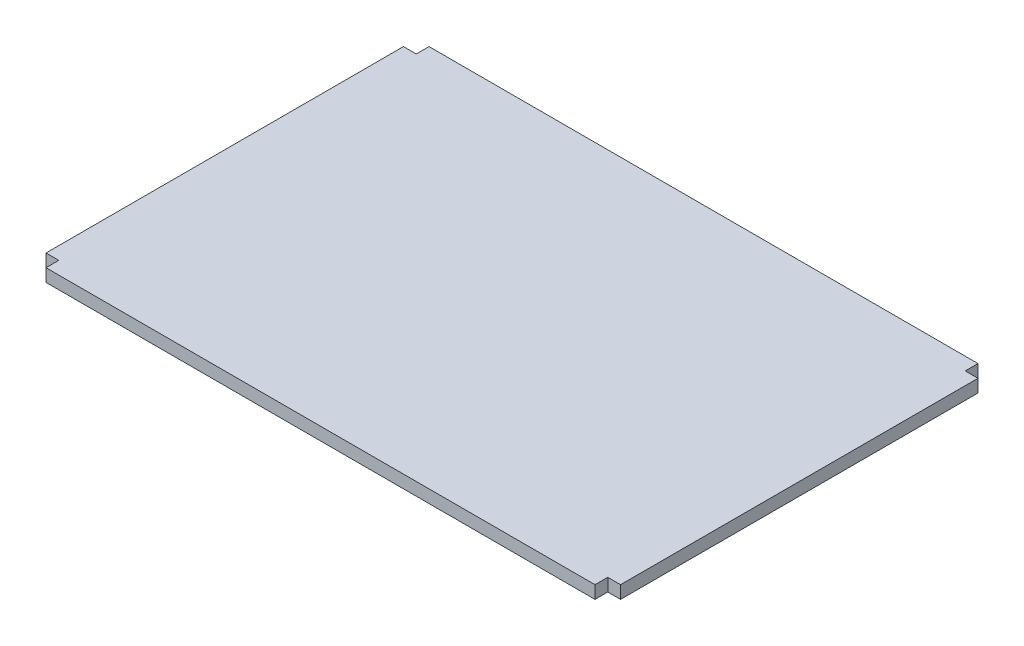
ISO-10303-21;
HEADER;
FILE_DESCRIPTION(('STEP AP214'),'2;1');
FILE_NAME('part.step','',(''),(''),'','','');
FILE_SCHEMA(('AUTOMOTIVE_DESIGN { 1 0 10303 214 1 1 1 1 }'));
ENDSEC;
DATA;
#1=APPLICATION_CONTEXT('core data for automotive mechanical design processes');
#2=APPLICATION_PROTOCOL_DEFINITION('international standard','automotive_design',2000,#1);
#3=PRODUCT_CONTEXT('',#1,'mechanical');
#4=PRODUCT('Part','Part','',(#3));
#5=PRODUCT_RELATED_PRODUCT_CATEGORY('part','',(#4));
#6=PRODUCT_DEFINITION_FORMATION('','',#4);
#7=PRODUCT_DEFINITION_CONTEXT('part definition',#1,'design');
#8=PRODUCT_DEFINITION('design','',#6,#7);
#9=PRODUCT_DEFINITION_SHAPE('','',#8);
#10=(LENGTH_UNIT() NAMED_UNIT(*) SI_UNIT(.MILLI.,.METRE.));
#11=(NAMED_UNIT(*) PLANE_ANGLE_UNIT() SI_UNIT($,.RADIAN.));
#12=(NAMED_UNIT(*) SI_UNIT($,.STERADIAN.) SOLID_ANGLE_UNIT());
#13=UNCERTAINTY_MEASURE_WITH_UNIT(LENGTH_MEASURE(1.E-05),#10,'distance_accuracy_value','');
#14=(GEOMETRIC_REPRESENTATION_CONTEXT(3) GLOBAL_UNCERTAINTY_ASSIGNED_CONTEXT((#13)) GLOBAL_UNIT_ASSIGNED_CONTEXT((#10,
#11,#12)) REPRESENTATION_CONTEXT('',''));
#15=CARTESIAN_POINT('',(0.,0.,0.));
#16=DIRECTION('',(0.,0.,1.));
#17=DIRECTION('',(1.,0.,0.));
#18=AXIS2_PLACEMENT_3D('',#15,#16,#17);
#19=CARTESIAN_POINT('',(-450.,20.,-300.));
#20=DIRECTION('',(1.,0.,0.));
#21=DIRECTION('',(0.,0.,-1.));
#22=AXIS2_PLACEMENT_3D('',#19,#20,#21);
#23=PLANE('',#22);
#24=DIRECTION('',(0.,0.,1.));
#25=VECTOR('',#24,1.);
#26=CARTESIAN_POINT('',(-450.,0.,-300.));
#27=LINE('',#26,#25);
#28=CARTESIAN_POINT('',(-450.,0.,-280.));
#29=VERTEX_POINT('',#28);
#30=CARTESIAN_POINT('',(-450.,0.,280.));
#31=VERTEX_POINT('',#30);
#32=EDGE_CURVE('E147',#29,#31,#27,.T.);
#33=ORIENTED_EDGE('',*,*,#32,.T.);
#34=DIRECTION('',(0.,1.,0.));
#35=VECTOR('',#34,1.);
#36=CARTESIAN_POINT('',(-450.,0.,280.));
#37=LINE('',#36,#35);
#38=CARTESIAN_POINT('',(-450.,20.,280.));
#39=VERTEX_POINT('',#38);
#40=EDGE_CURVE('E204',#31,#39,#37,.T.);
#41=ORIENTED_EDGE('',*,*,#40,.T.);
#42=DIRECTION('',(0.,0.,1.));
#43=VECTOR('',#42,1.);
#44=CARTESIAN_POINT('',(-450.,20.,-300.));
#45=LINE('',#44,#43);
#46=CARTESIAN_POINT('',(-450.,20.,-280.));
#47=VERTEX_POINT('',#46);
#48=EDGE_CURVE('E155',#47,#39,#45,.T.);
#49=ORIENTED_EDGE('',*,*,#48,.F.);
#50=DIRECTION('',(0.,1.,0.));
#51=VECTOR('',#50,1.);
#52=CARTESIAN_POINT('',(-450.,0.,-280.));
#53=LINE('',#52,#51);
#54=EDGE_CURVE('E192',#29,#47,#53,.T.);
#55=ORIENTED_EDGE('',*,*,#54,.F.);
#56=EDGE_LOOP('',(#33,#41,#49,#55));
#57=FACE_BOUND('',#56,.T.);
#58=ADVANCED_FACE('F34',(#57),#23,.F.);
#59=CARTESIAN_POINT('',(450.,20.,300.));
#60=DIRECTION('',(0.,0.,-1.));
#61=DIRECTION('',(-1.,0.,0.));
#62=AXIS2_PLACEMENT_3D('',#59,#60,#61);
#63=PLANE('',#62);
#64=DIRECTION('',(1.,0.,0.));
#65=VECTOR('',#64,1.);
#66=CARTESIAN_POINT('',(450.,20.,300.));
#67=LINE('',#66,#65);
#68=CARTESIAN_POINT('',(-430.,20.,300.));
#69=VERTEX_POINT('',#68);
#70=CARTESIAN_POINT('',(430.,20.,300.));
#71=VERTEX_POINT('',#70);
#72=EDGE_CURVE('E140',#69,#71,#67,.T.);
#73=ORIENTED_EDGE('',*,*,#72,.F.);
#74=DIRECTION('',(0.,1.,0.));
#75=VECTOR('',#74,1.);
#76=CARTESIAN_POINT('',(-430.,0.,300.));
#77=LINE('',#76,#75);
#78=CARTESIAN_POINT('',(-430.,0.,300.));
#79=VERTEX_POINT('',#78);
#80=EDGE_CURVE('E127',#79,#69,#77,.T.);
#81=ORIENTED_EDGE('',*,*,#80,.F.);
#82=DIRECTION('',(1.,0.,0.));
#83=VECTOR('',#82,1.);
#84=CARTESIAN_POINT('',(450.,0.,300.));
#85=LINE('',#84,#83);
#86=CARTESIAN_POINT('',(430.,0.,300.));
#87=VERTEX_POINT('',#86);
#88=EDGE_CURVE('E138',#79,#87,#85,.T.);
#89=ORIENTED_EDGE('',*,*,#88,.T.);
#90=DIRECTION('',(0.,1.,0.));
#91=VECTOR('',#90,1.);
#92=CARTESIAN_POINT('',(430.,0.,300.));
#93=LINE('',#92,#91);
#94=EDGE_CURVE('E172',#87,#71,#93,.T.);
#95=ORIENTED_EDGE('',*,*,#94,.T.);
#96=EDGE_LOOP('',(#73,#81,#89,#95));
#97=FACE_BOUND('',#96,.T.);
#98=ADVANCED_FACE('F136',(#97),#63,.F.);
#99=CARTESIAN_POINT('',(450.,20.,-300.));
#100=DIRECTION('',(-1.,0.,0.));
#101=DIRECTION('',(0.,0.,1.));
#102=AXIS2_PLACEMENT_3D('',#99,#100,#101);
#103=PLANE('',#102);
#104=DIRECTION('',(0.,0.,-1.));
#105=VECTOR('',#104,1.);
#106=CARTESIAN_POINT('',(450.,20.,-300.));
#107=LINE('',#106,#105);
#108=CARTESIAN_POINT('',(450.,20.,280.));
#109=VERTEX_POINT('',#108);
#110=CARTESIAN_POINT('',(450.,20.,-280.));
#111=VERTEX_POINT('',#110);
#112=EDGE_CURVE('E42',#109,#111,#107,.T.);
#113=ORIENTED_EDGE('',*,*,#112,.F.);
#114=DIRECTION('',(0.,1.,0.));
#115=VECTOR('',#114,1.);
#116=CARTESIAN_POINT('',(450.,0.,280.));
#117=LINE('',#116,#115);
#118=CARTESIAN_POINT('',(450.,0.,280.));
#119=VERTEX_POINT('',#118);
#120=EDGE_CURVE('E177',#119,#109,#117,.T.);
#121=ORIENTED_EDGE('',*,*,#120,.F.);
#122=DIRECTION('',(0.,0.,-1.));
#123=VECTOR('',#122,1.);
#124=CARTESIAN_POINT('',(450.,0.,-300.));
#125=LINE('',#124,#123);
#126=CARTESIAN_POINT('',(450.,0.,-280.));
#127=VERTEX_POINT('',#126);
#128=EDGE_CURVE('E146',#119,#127,#125,.T.);
#129=ORIENTED_EDGE('',*,*,#128,.T.);
#130=DIRECTION('',(0.,1.,0.));
#131=VECTOR('',#130,1.);
#132=CARTESIAN_POINT('',(450.,0.,-280.));
#133=LINE('',#132,#131);
#134=EDGE_CURVE('E150',#127,#111,#133,.T.);
#135=ORIENTED_EDGE('',*,*,#134,.T.);
#136=EDGE_LOOP('',(#113,#121,#129,#135));
#137=FACE_BOUND('',#136,.T.);
#138=ADVANCED_FACE('F243',(#137),#103,.F.);
#139=CARTESIAN_POINT('',(450.,20.,-300.));
#140=DIRECTION('',(0.,0.,1.));
#141=DIRECTION('',(1.,0.,0.));
#142=AXIS2_PLACEMENT_3D('',#139,#140,#141);
#143=PLANE('',#142);
#144=DIRECTION('',(-1.,0.,0.));
#145=VECTOR('',#144,1.);
#146=CARTESIAN_POINT('',(450.,0.,-300.));
#147=LINE('',#146,#145);
#148=CARTESIAN_POINT('',(430.,0.,-300.));
#149=VERTEX_POINT('',#148);
#150=CARTESIAN_POINT('',(-430.,0.,-300.));
#151=VERTEX_POINT('',#150);
#152=EDGE_CURVE('E37',#149,#151,#147,.T.);
#153=ORIENTED_EDGE('',*,*,#152,.T.);
#154=DIRECTION('',(0.,1.,0.));
#155=VECTOR('',#154,1.);
#156=CARTESIAN_POINT('',(-430.,0.,-300.));
#157=LINE('',#156,#155);
#158=CARTESIAN_POINT('',(-430.,20.,-300.));
#159=VERTEX_POINT('',#158);
#160=EDGE_CURVE('E189',#151,#159,#157,.T.);
#161=ORIENTED_EDGE('',*,*,#160,.T.);
#162=DIRECTION('',(-1.,0.,0.));
#163=VECTOR('',#162,1.);
#164=CARTESIAN_POINT('',(450.,20.,-300.));
#165=LINE('',#164,#163);
#166=CARTESIAN_POINT('',(430.,20.,-300.));
#167=VERTEX_POINT('',#166);
#168=EDGE_CURVE('E11',#167,#159,#165,.T.);
#169=ORIENTED_EDGE('',*,*,#168,.F.);
#170=DIRECTION('',(0.,1.,0.));
#171=VECTOR('',#170,1.);
#172=CARTESIAN_POINT('',(430.,0.,-300.));
#173=LINE('',#172,#171);
#174=EDGE_CURVE('E158',#149,#167,#173,.T.);
#175=ORIENTED_EDGE('',*,*,#174,.F.);
#176=EDGE_LOOP('',(#153,#161,#169,#175));
#177=FACE_BOUND('',#176,.T.);
#178=ADVANCED_FACE('F230',(#177),#143,.F.);
#179=CARTESIAN_POINT('',(0.,20.,0.));
#180=DIRECTION('',(0.,-1.,0.));
#181=DIRECTION('',(0.,0.,-1.));
#182=AXIS2_PLACEMENT_3D('',#179,#180,#181);
#183=PLANE('',#182);
#184=ORIENTED_EDGE('',*,*,#48,.T.);
#185=DIRECTION('',(-1.,0.,0.));
#186=VECTOR('',#185,1.);
#187=CARTESIAN_POINT('',(-450.,20.,280.));
#188=LINE('',#187,#186);
#189=CARTESIAN_POINT('',(-430.,20.,280.));
#190=VERTEX_POINT('',#189);
#191=EDGE_CURVE('E132',#190,#39,#188,.T.);
#192=ORIENTED_EDGE('',*,*,#191,.F.);
#193=DIRECTION('',(0.,0.,-1.));
#194=VECTOR('',#193,1.);
#195=CARTESIAN_POINT('',(-430.,20.,300.));
#196=LINE('',#195,#194);
#197=EDGE_CURVE('E212',#69,#190,#196,.T.);
#198=ORIENTED_EDGE('',*,*,#197,.F.);
#199=ORIENTED_EDGE('',*,*,#72,.T.);
#200=DIRECTION('',(0.,0.,1.));
#201=VECTOR('',#200,1.);
#202=CARTESIAN_POINT('',(430.,20.,300.));
#203=LINE('',#202,#201);
#204=CARTESIAN_POINT('',(430.,20.,280.));
#205=VERTEX_POINT('',#204);
#206=EDGE_CURVE('E182',#205,#71,#203,.T.);
#207=ORIENTED_EDGE('',*,*,#206,.F.);
#208=DIRECTION('',(-1.,0.,0.));
#209=VECTOR('',#208,1.);
#210=CARTESIAN_POINT('',(450.,20.,280.));
#211=LINE('',#210,#209);
#212=EDGE_CURVE('E186',#109,#205,#211,.T.);
#213=ORIENTED_EDGE('',*,*,#212,.F.);
#214=ORIENTED_EDGE('',*,*,#112,.T.);
#215=DIRECTION('',(1.,0.,0.));
#216=VECTOR('',#215,1.);
#217=CARTESIAN_POINT('',(450.,20.,-280.));
#218=LINE('',#217,#216);
#219=CARTESIAN_POINT('',(430.,20.,-280.));
#220=VERTEX_POINT('',#219);
#221=EDGE_CURVE('E165',#220,#111,#218,.T.);
#222=ORIENTED_EDGE('',*,*,#221,.F.);
#223=DIRECTION('',(0.,0.,1.));
#224=VECTOR('',#223,1.);
#225=CARTESIAN_POINT('',(430.,20.,-300.));
#226=LINE('',#225,#224);
#227=EDGE_CURVE('E169',#167,#220,#226,.T.);
#228=ORIENTED_EDGE('',*,*,#227,.F.);
#229=ORIENTED_EDGE('',*,*,#168,.T.);
#230=DIRECTION('',(0.,0.,-1.));
#231=VECTOR('',#230,1.);
#232=CARTESIAN_POINT('',(-430.,20.,-300.));
#233=LINE('',#232,#231);
#234=CARTESIAN_POINT('',(-430.,20.,-280.));
#235=VERTEX_POINT('',#234);
#236=EDGE_CURVE('E198',#235,#159,#233,.T.);
#237=ORIENTED_EDGE('',*,*,#236,.F.);
#238=DIRECTION('',(1.,0.,0.));
#239=VECTOR('',#238,1.);
#240=CARTESIAN_POINT('',(-450.,20.,-280.));
#241=LINE('',#240,#239);
#242=EDGE_CURVE('E201',#47,#235,#241,.T.);
#243=ORIENTED_EDGE('',*,*,#242,.F.);
#244=EDGE_LOOP('',(#184,#192,#198,#199,#207,#213,#214,#222,#228,#229,#237,#243));
#245=FACE_BOUND('',#244,.T.);
#246=ADVANCED_FACE('F223',(#245),#183,.F.);
#247=CARTESIAN_POINT('',(0.,0.,0.));
#248=DIRECTION('',(0.,-1.,0.));
#249=DIRECTION('',(0.,0.,-1.));
#250=AXIS2_PLACEMENT_3D('',#247,#248,#249);
#251=PLANE('',#250);
#252=DIRECTION('',(-1.,0.,0.));
#253=VECTOR('',#252,1.);
#254=CARTESIAN_POINT('',(-450.,0.,280.));
#255=LINE('',#254,#253);
#256=CARTESIAN_POINT('',(-430.,0.,280.));
#257=VERTEX_POINT('',#256);
#258=EDGE_CURVE('E50',#257,#31,#255,.T.);
#259=ORIENTED_EDGE('',*,*,#258,.T.);
#260=ORIENTED_EDGE('',*,*,#32,.F.);
#261=DIRECTION('',(1.,0.,0.));
#262=VECTOR('',#261,1.);
#263=CARTESIAN_POINT('',(-450.,0.,-280.));
#264=LINE('',#263,#262);
#265=CARTESIAN_POINT('',(-430.,0.,-280.));
#266=VERTEX_POINT('',#265);
#267=EDGE_CURVE('E200',#29,#266,#264,.T.);
#268=ORIENTED_EDGE('',*,*,#267,.T.);
#269=DIRECTION('',(0.,0.,-1.));
#270=VECTOR('',#269,1.);
#271=CARTESIAN_POINT('',(-430.,0.,-300.));
#272=LINE('',#271,#270);
#273=EDGE_CURVE('E58',#266,#151,#272,.T.);
#274=ORIENTED_EDGE('',*,*,#273,.T.);
#275=ORIENTED_EDGE('',*,*,#152,.F.);
#276=DIRECTION('',(0.,0.,1.));
#277=VECTOR('',#276,1.);
#278=CARTESIAN_POINT('',(430.,0.,-300.));
#279=LINE('',#278,#277);
#280=CARTESIAN_POINT('',(430.,0.,-280.));
#281=VERTEX_POINT('',#280);
#282=EDGE_CURVE('E168',#149,#281,#279,.T.);
#283=ORIENTED_EDGE('',*,*,#282,.T.);
#284=DIRECTION('',(1.,0.,0.));
#285=VECTOR('',#284,1.);
#286=CARTESIAN_POINT('',(450.,0.,-280.));
#287=LINE('',#286,#285);
#288=EDGE_CURVE('E161',#281,#127,#287,.T.);
#289=ORIENTED_EDGE('',*,*,#288,.T.);
#290=ORIENTED_EDGE('',*,*,#128,.F.);
#291=DIRECTION('',(-1.,0.,0.));
#292=VECTOR('',#291,1.);
#293=CARTESIAN_POINT('',(450.,0.,280.));
#294=LINE('',#293,#292);
#295=CARTESIAN_POINT('',(430.,0.,280.));
#296=VERTEX_POINT('',#295);
#297=EDGE_CURVE('E185',#119,#296,#294,.T.);
#298=ORIENTED_EDGE('',*,*,#297,.T.);
#299=DIRECTION('',(0.,0.,1.));
#300=VECTOR('',#299,1.);
#301=CARTESIAN_POINT('',(430.,0.,300.));
#302=LINE('',#301,#300);
#303=EDGE_CURVE('E145',#296,#87,#302,.T.);
#304=ORIENTED_EDGE('',*,*,#303,.T.);
#305=ORIENTED_EDGE('',*,*,#88,.F.);
#306=DIRECTION('',(0.,0.,-1.));
#307=VECTOR('',#306,1.);
#308=CARTESIAN_POINT('',(-430.,0.,300.));
#309=LINE('',#308,#307);
#310=EDGE_CURVE('E123',#79,#257,#309,.T.);
#311=ORIENTED_EDGE('',*,*,#310,.T.);
#312=EDGE_LOOP('',(#259,#260,#268,#274,#275,#283,#289,#290,#298,#304,#305,#311));
#313=FACE_BOUND('',#312,.T.);
#314=ADVANCED_FACE('F143',(#313),#251,.T.);
#315=CARTESIAN_POINT('',(450.,0.,-280.));
#316=DIRECTION('',(0.,0.,1.));
#317=DIRECTION('',(1.,0.,0.));
#318=AXIS2_PLACEMENT_3D('',#315,#316,#317);
#319=PLANE('',#318);
#320=ORIENTED_EDGE('',*,*,#221,.T.);
#321=ORIENTED_EDGE('',*,*,#134,.F.);
#322=ORIENTED_EDGE('',*,*,#288,.F.);
#323=DIRECTION('',(0.,1.,0.));
#324=VECTOR('',#323,1.);
#325=CARTESIAN_POINT('',(430.,0.,-280.));
#326=LINE('',#325,#324);
#327=EDGE_CURVE('E160',#281,#220,#326,.T.);
#328=ORIENTED_EDGE('',*,*,#327,.T.);
#329=EDGE_LOOP('',(#320,#321,#322,#328));
#330=FACE_BOUND('',#329,.T.);
#331=ADVANCED_FACE('F239',(#330),#319,.F.);
#332=CARTESIAN_POINT('',(430.,0.,-300.));
#333=DIRECTION('',(-1.,0.,0.));
#334=DIRECTION('',(0.,0.,1.));
#335=AXIS2_PLACEMENT_3D('',#332,#333,#334);
#336=PLANE('',#335);
#337=ORIENTED_EDGE('',*,*,#227,.T.);
#338=ORIENTED_EDGE('',*,*,#327,.F.);
#339=ORIENTED_EDGE('',*,*,#282,.F.);
#340=ORIENTED_EDGE('',*,*,#174,.T.);
#341=EDGE_LOOP('',(#337,#338,#339,#340));
#342=FACE_BOUND('',#341,.T.);
#343=ADVANCED_FACE('F236',(#342),#336,.F.);
#344=CARTESIAN_POINT('',(430.,0.,300.));
#345=DIRECTION('',(-1.,0.,0.));
#346=DIRECTION('',(0.,0.,1.));
#347=AXIS2_PLACEMENT_3D('',#344,#345,#346);
#348=PLANE('',#347);
#349=ORIENTED_EDGE('',*,*,#206,.T.);
#350=ORIENTED_EDGE('',*,*,#94,.F.);
#351=ORIENTED_EDGE('',*,*,#303,.F.);
#352=DIRECTION('',(0.,1.,0.));
#353=VECTOR('',#352,1.);
#354=CARTESIAN_POINT('',(430.,0.,280.));
#355=LINE('',#354,#353);
#356=EDGE_CURVE('E179',#296,#205,#355,.T.);
#357=ORIENTED_EDGE('',*,*,#356,.T.);
#358=EDGE_LOOP('',(#349,#350,#351,#357));
#359=FACE_BOUND('',#358,.T.);
#360=ADVANCED_FACE('F251',(#359),#348,.F.);
#361=CARTESIAN_POINT('',(450.,0.,280.));
#362=DIRECTION('',(0.,0.,-1.));
#363=DIRECTION('',(-1.,0.,0.));
#364=AXIS2_PLACEMENT_3D('',#361,#362,#363);
#365=PLANE('',#364);
#366=ORIENTED_EDGE('',*,*,#212,.T.);
#367=ORIENTED_EDGE('',*,*,#356,.F.);
#368=ORIENTED_EDGE('',*,*,#297,.F.);
#369=ORIENTED_EDGE('',*,*,#120,.T.);
#370=EDGE_LOOP('',(#366,#367,#368,#369));
#371=FACE_BOUND('',#370,.T.);
#372=ADVANCED_FACE('F247',(#371),#365,.F.);
#373=CARTESIAN_POINT('',(-430.,0.,-300.));
#374=DIRECTION('',(1.,0.,0.));
#375=DIRECTION('',(0.,0.,-1.));
#376=AXIS2_PLACEMENT_3D('',#373,#374,#375);
#377=PLANE('',#376);
#378=ORIENTED_EDGE('',*,*,#236,.T.);
#379=ORIENTED_EDGE('',*,*,#160,.F.);
#380=ORIENTED_EDGE('',*,*,#273,.F.);
#381=DIRECTION('',(0.,1.,0.));
#382=VECTOR('',#381,1.);
#383=CARTESIAN_POINT('',(-430.,0.,-280.));
#384=LINE('',#383,#382);
#385=EDGE_CURVE('E194',#266,#235,#384,.T.);
#386=ORIENTED_EDGE('',*,*,#385,.T.);
#387=EDGE_LOOP('',(#378,#379,#380,#386));
#388=FACE_BOUND('',#387,.T.);
#389=ADVANCED_FACE('F227',(#388),#377,.F.);
#390=CARTESIAN_POINT('',(-450.,0.,-280.));
#391=DIRECTION('',(0.,0.,1.));
#392=DIRECTION('',(1.,0.,0.));
#393=AXIS2_PLACEMENT_3D('',#390,#391,#392);
#394=PLANE('',#393);
#395=ORIENTED_EDGE('',*,*,#242,.T.);
#396=ORIENTED_EDGE('',*,*,#385,.F.);
#397=ORIENTED_EDGE('',*,*,#267,.F.);
#398=ORIENTED_EDGE('',*,*,#54,.T.);
#399=EDGE_LOOP('',(#395,#396,#397,#398));
#400=FACE_BOUND('',#399,.T.);
#401=ADVANCED_FACE('F220',(#400),#394,.F.);
#402=CARTESIAN_POINT('',(-450.,0.,280.));
#403=DIRECTION('',(0.,0.,-1.));
#404=DIRECTION('',(-1.,0.,0.));
#405=AXIS2_PLACEMENT_3D('',#402,#403,#404);
#406=PLANE('',#405);
#407=ORIENTED_EDGE('',*,*,#191,.T.);
#408=ORIENTED_EDGE('',*,*,#40,.F.);
#409=ORIENTED_EDGE('',*,*,#258,.F.);
#410=DIRECTION('',(0.,1.,0.));
#411=VECTOR('',#410,1.);
#412=CARTESIAN_POINT('',(-430.,0.,280.));
#413=LINE('',#412,#411);
#414=EDGE_CURVE('E129',#257,#190,#413,.T.);
#415=ORIENTED_EDGE('',*,*,#414,.T.);
#416=EDGE_LOOP('',(#407,#408,#409,#415));
#417=FACE_BOUND('',#416,.T.);
#418=ADVANCED_FACE('F252',(#417),#406,.F.);
#419=CARTESIAN_POINT('',(-430.,0.,300.));
#420=DIRECTION('',(1.,0.,0.));
#421=DIRECTION('',(0.,0.,-1.));
#422=AXIS2_PLACEMENT_3D('',#419,#420,#421);
#423=PLANE('',#422);
#424=ORIENTED_EDGE('',*,*,#197,.T.);
#425=ORIENTED_EDGE('',*,*,#414,.F.);
#426=ORIENTED_EDGE('',*,*,#310,.F.);
#427=ORIENTED_EDGE('',*,*,#80,.T.);
#428=EDGE_LOOP('',(#424,#425,#426,#427));
#429=FACE_BOUND('',#428,.T.);
#430=ADVANCED_FACE('F126',(#429),#423,.F.);
#431=CLOSED_SHELL('',(#58,#98,#138,#178,#246,#314,#331,#343,#360,#372,#389,#401,#418,#430));
#432=MANIFOLD_SOLID_BREP('B2',#431);
#433=ADVANCED_BREP_SHAPE_REPRESENTATION('',(#18,#432),#14);
#434=SHAPE_DEFINITION_REPRESENTATION(#9,#433);
ENDSEC;
END-ISO-10303-21;
